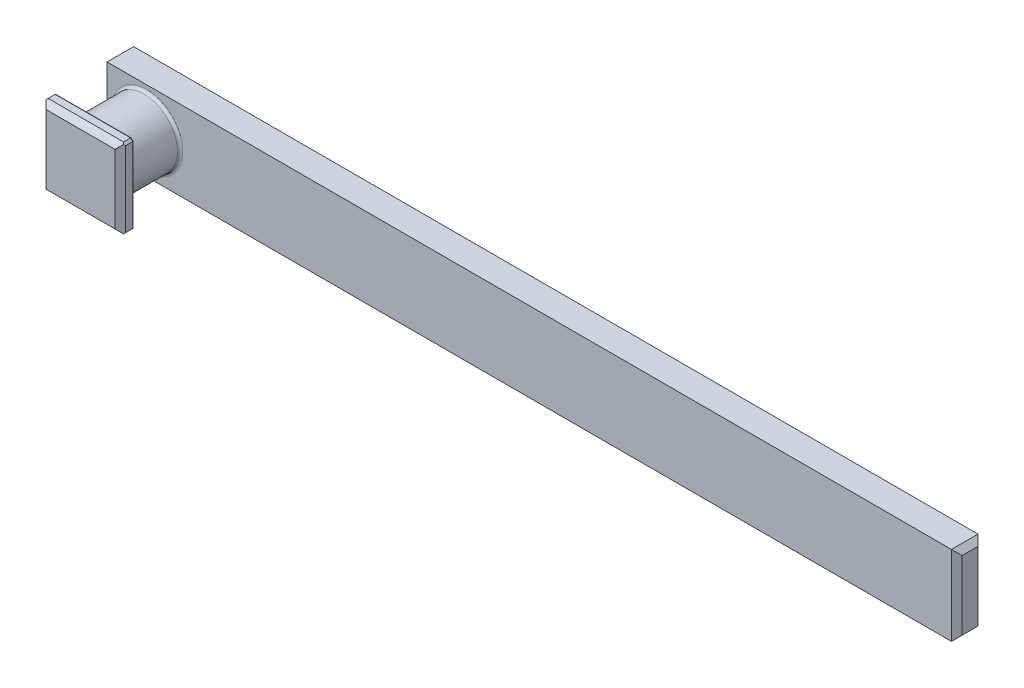
ISO-10303-21;
HEADER;
FILE_DESCRIPTION(('STEP AP214'),'2;1');
FILE_NAME('part.step','',(''),(''),'','','');
FILE_SCHEMA(('AUTOMOTIVE_DESIGN { 1 0 10303 214 1 1 1 1 }'));
ENDSEC;
DATA;
#1=APPLICATION_CONTEXT('core data for automotive mechanical design processes');
#2=APPLICATION_PROTOCOL_DEFINITION('international standard','automotive_design',2000,#1);
#3=PRODUCT_CONTEXT('',#1,'mechanical');
#4=PRODUCT('Part','Part','',(#3));
#5=PRODUCT_RELATED_PRODUCT_CATEGORY('part','',(#4));
#6=PRODUCT_DEFINITION_FORMATION('','',#4);
#7=PRODUCT_DEFINITION_CONTEXT('part definition',#1,'design');
#8=PRODUCT_DEFINITION('design','',#6,#7);
#9=PRODUCT_DEFINITION_SHAPE('','',#8);
#10=(LENGTH_UNIT() NAMED_UNIT(*) SI_UNIT(.MILLI.,.METRE.));
#11=(NAMED_UNIT(*) PLANE_ANGLE_UNIT() SI_UNIT($,.RADIAN.));
#12=(NAMED_UNIT(*) SI_UNIT($,.STERADIAN.) SOLID_ANGLE_UNIT());
#13=UNCERTAINTY_MEASURE_WITH_UNIT(LENGTH_MEASURE(1.E-05),#10,'distance_accuracy_value','');
#14=(GEOMETRIC_REPRESENTATION_CONTEXT(3) GLOBAL_UNCERTAINTY_ASSIGNED_CONTEXT((#13)) GLOBAL_UNIT_ASSIGNED_CONTEXT((#10,
#11,#12)) REPRESENTATION_CONTEXT('',''));
#15=CARTESIAN_POINT('',(0.,0.,0.));
#16=DIRECTION('',(0.,0.,1.));
#17=DIRECTION('',(1.,0.,0.));
#18=AXIS2_PLACEMENT_3D('',#15,#16,#17);
#19=CARTESIAN_POINT('',(-152.4,9.525,3.17499999999999));
#20=DIRECTION('',(1.,0.,0.));
#21=DIRECTION('',(0.,0.,-1.));
#22=AXIS2_PLACEMENT_3D('',#19,#20,#21);
#23=PLANE('',#22);
#24=DIRECTION('',(0.,0.,-1.));
#25=VECTOR('',#24,1.);
#26=CARTESIAN_POINT('',(-152.4,9.525,3.17499999999999));
#27=LINE('',#26,#25);
#28=CARTESIAN_POINT('',(-152.4,9.525,3.17499999999999));
#29=VERTEX_POINT('',#28);
#30=CARTESIAN_POINT('',(-152.4,9.525,-3.17500000000001));
#31=VERTEX_POINT('',#30);
#32=EDGE_CURVE('E200',#29,#31,#27,.T.);
#33=ORIENTED_EDGE('',*,*,#32,.T.);
#34=DIRECTION('',(0.,-1.,0.));
#35=VECTOR('',#34,1.);
#36=CARTESIAN_POINT('',(-152.4,9.525,-3.17500000000001));
#37=LINE('',#36,#35);
#38=CARTESIAN_POINT('',(-152.4,-9.525,-3.17500000000001));
#39=VERTEX_POINT('',#38);
#40=EDGE_CURVE('E206',#31,#39,#37,.T.);
#41=ORIENTED_EDGE('',*,*,#40,.T.);
#42=DIRECTION('',(0.,0.,-1.));
#43=VECTOR('',#42,1.);
#44=CARTESIAN_POINT('',(-152.4,-9.525,3.17499999999999));
#45=LINE('',#44,#43);
#46=CARTESIAN_POINT('',(-152.4,-9.525,3.17499999999999));
#47=VERTEX_POINT('',#46);
#48=EDGE_CURVE('E187',#47,#39,#45,.T.);
#49=ORIENTED_EDGE('',*,*,#48,.F.);
#50=DIRECTION('',(0.,-1.,0.));
#51=VECTOR('',#50,1.);
#52=CARTESIAN_POINT('',(-152.4,9.525,3.17499999999999));
#53=LINE('',#52,#51);
#54=EDGE_CURVE('E223',#29,#47,#53,.T.);
#55=ORIENTED_EDGE('',*,*,#54,.F.);
#56=EDGE_LOOP('',(#33,#41,#49,#55));
#57=FACE_BOUND('',#56,.T.);
#58=ADVANCED_FACE('F35',(#57),#23,.F.);
#59=CARTESIAN_POINT('',(-152.4,-9.525,3.17499999999999));
#60=DIRECTION('',(0.,1.,0.));
#61=DIRECTION('',(0.,0.,1.));
#62=AXIS2_PLACEMENT_3D('',#59,#60,#61);
#63=PLANE('',#62);
#64=DIRECTION('',(1.,0.,0.));
#65=VECTOR('',#64,1.);
#66=CARTESIAN_POINT('',(-152.4,-9.525,-3.17500000000001));
#67=LINE('',#66,#65);
#68=CARTESIAN_POINT('',(49.53,-9.525,-3.17500000000001));
#69=VERTEX_POINT('',#68);
#70=EDGE_CURVE('E191',#39,#69,#67,.T.);
#71=ORIENTED_EDGE('',*,*,#70,.T.);
#72=DIRECTION('',(0.,0.,1.));
#73=VECTOR('',#72,1.);
#74=CARTESIAN_POINT('',(49.53,-9.525,3.17499999999999));
#75=LINE('',#74,#73);
#76=CARTESIAN_POINT('',(49.53,-9.525,3.17499999999999));
#77=VERTEX_POINT('',#76);
#78=EDGE_CURVE('E237',#69,#77,#75,.T.);
#79=ORIENTED_EDGE('',*,*,#78,.T.);
#80=DIRECTION('',(1.,0.,0.));
#81=VECTOR('',#80,1.);
#82=CARTESIAN_POINT('',(-152.4,-9.525,3.17499999999999));
#83=LINE('',#82,#81);
#84=EDGE_CURVE('E194',#47,#77,#83,.T.);
#85=ORIENTED_EDGE('',*,*,#84,.F.);
#86=ORIENTED_EDGE('',*,*,#48,.T.);
#87=EDGE_LOOP('',(#71,#79,#85,#86));
#88=FACE_BOUND('',#87,.T.);
#89=ADVANCED_FACE('F189',(#88),#63,.F.);
#90=CARTESIAN_POINT('',(50.8,9.525,3.17499999999999));
#91=DIRECTION('',(-1.,0.,0.));
#92=DIRECTION('',(0.,0.,1.));
#93=AXIS2_PLACEMENT_3D('',#90,#91,#92);
#94=PLANE('',#93);
#95=DIRECTION('',(0.,-1.,0.));
#96=VECTOR('',#95,1.);
#97=CARTESIAN_POINT('',(50.8,-9.525,1.90499999999999));
#98=LINE('',#97,#96);
#99=CARTESIAN_POINT('',(50.8,8.25500000000001,1.90499999999999));
#100=VERTEX_POINT('',#99);
#101=CARTESIAN_POINT('',(50.8,-8.25500000000001,1.90499999999999));
#102=VERTEX_POINT('',#101);
#103=EDGE_CURVE('E199',#100,#102,#98,.T.);
#104=ORIENTED_EDGE('',*,*,#103,.T.);
#105=DIRECTION('',(0.,0.,-1.));
#106=VECTOR('',#105,1.);
#107=CARTESIAN_POINT('',(50.8,-8.25500000000001,3.17499999999999));
#108=LINE('',#107,#106);
#109=CARTESIAN_POINT('',(50.8,-8.25500000000001,-1.90500000000002));
#110=VERTEX_POINT('',#109);
#111=EDGE_CURVE('E234',#102,#110,#108,.T.);
#112=ORIENTED_EDGE('',*,*,#111,.T.);
#113=DIRECTION('',(0.,1.,0.));
#114=VECTOR('',#113,1.);
#115=CARTESIAN_POINT('',(50.8,9.525,-1.90500000000002));
#116=LINE('',#115,#114);
#117=CARTESIAN_POINT('',(50.8,8.25500000000001,-1.90500000000002));
#118=VERTEX_POINT('',#117);
#119=EDGE_CURVE('E232',#110,#118,#116,.T.);
#120=ORIENTED_EDGE('',*,*,#119,.T.);
#121=DIRECTION('',(0.,0.,1.));
#122=VECTOR('',#121,1.);
#123=CARTESIAN_POINT('',(50.8,8.25500000000001,3.17499999999999));
#124=LINE('',#123,#122);
#125=EDGE_CURVE('E230',#118,#100,#124,.T.);
#126=ORIENTED_EDGE('',*,*,#125,.T.);
#127=EDGE_LOOP('',(#104,#112,#120,#126));
#128=FACE_BOUND('',#127,.T.);
#129=ADVANCED_FACE('F467',(#128),#94,.F.);
#130=CARTESIAN_POINT('',(-152.4,9.525,3.17499999999999));
#131=DIRECTION('',(0.,-1.,0.));
#132=DIRECTION('',(0.,0.,-1.));
#133=AXIS2_PLACEMENT_3D('',#130,#131,#132);
#134=PLANE('',#133);
#135=DIRECTION('',(-1.,0.,0.));
#136=VECTOR('',#135,1.);
#137=CARTESIAN_POINT('',(-152.4,9.525,3.17499999999999));
#138=LINE('',#137,#136);
#139=CARTESIAN_POINT('',(49.53,9.525,3.17499999999999));
#140=VERTEX_POINT('',#139);
#141=EDGE_CURVE('E226',#140,#29,#138,.T.);
#142=ORIENTED_EDGE('',*,*,#141,.F.);
#143=DIRECTION('',(0.,0.,-1.));
#144=VECTOR('',#143,1.);
#145=CARTESIAN_POINT('',(49.53,9.525,3.17499999999999));
#146=LINE('',#145,#144);
#147=CARTESIAN_POINT('',(49.53,9.525,-3.17500000000001));
#148=VERTEX_POINT('',#147);
#149=EDGE_CURVE('E240',#140,#148,#146,.T.);
#150=ORIENTED_EDGE('',*,*,#149,.T.);
#151=DIRECTION('',(-1.,0.,0.));
#152=VECTOR('',#151,1.);
#153=CARTESIAN_POINT('',(-152.4,9.525,-3.17500000000001));
#154=LINE('',#153,#152);
#155=EDGE_CURVE('E209',#148,#31,#154,.T.);
#156=ORIENTED_EDGE('',*,*,#155,.T.);
#157=ORIENTED_EDGE('',*,*,#32,.F.);
#158=EDGE_LOOP('',(#142,#150,#156,#157));
#159=FACE_BOUND('',#158,.T.);
#160=ADVANCED_FACE('F525',(#159),#134,.F.);
#161=CARTESIAN_POINT('',(0.,0.,3.17499999999999));
#162=DIRECTION('',(0.,0.,1.));
#163=DIRECTION('',(1.,0.,0.));
#164=AXIS2_PLACEMENT_3D('',#161,#162,#163);
#165=PLANE('',#164);
#166=CARTESIAN_POINT('',(-142.875,0.,3.17499999999999));
#167=DIRECTION('',(0.,0.,1.));
#168=DIRECTION('',(1.,0.,0.));
#169=AXIS2_PLACEMENT_3D('',#166,#167,#168);
#170=CIRCLE('',#169,8.57249999999998);
#171=CARTESIAN_POINT('',(-134.3025,0.,3.17499999999999));
#172=VERTEX_POINT('',#171);
#173=EDGE_CURVE('E305',#172,#172,#170,.F.);
#174=ORIENTED_EDGE('',*,*,#173,.T.);
#175=EDGE_LOOP('',(#174));
#176=FACE_BOUND('',#175,.T.);
#177=ORIENTED_EDGE('',*,*,#84,.T.);
#178=DIRECTION('',(0.,1.,0.));
#179=VECTOR('',#178,1.);
#180=CARTESIAN_POINT('',(49.53,9.525,3.17499999999999));
#181=LINE('',#180,#179);
#182=EDGE_CURVE('E242',#77,#140,#181,.T.);
#183=ORIENTED_EDGE('',*,*,#182,.T.);
#184=ORIENTED_EDGE('',*,*,#141,.T.);
#185=ORIENTED_EDGE('',*,*,#54,.T.);
#186=EDGE_LOOP('',(#177,#183,#184,#185));
#187=FACE_BOUND('',#186,.T.);
#188=ADVANCED_FACE('F522',(#176,#187),#165,.T.);
#189=CARTESIAN_POINT('',(0.,0.,-3.17500000000001));
#190=DIRECTION('',(0.,0.,1.));
#191=DIRECTION('',(1.,0.,0.));
#192=AXIS2_PLACEMENT_3D('',#189,#190,#191);
#193=PLANE('',#192);
#194=ORIENTED_EDGE('',*,*,#155,.F.);
#195=DIRECTION('',(0.,-1.,0.));
#196=VECTOR('',#195,1.);
#197=CARTESIAN_POINT('',(49.53,0.,-3.17500000000001));
#198=LINE('',#197,#196);
#199=EDGE_CURVE('E208',#148,#69,#198,.T.);
#200=ORIENTED_EDGE('',*,*,#199,.T.);
#201=ORIENTED_EDGE('',*,*,#70,.F.);
#202=ORIENTED_EDGE('',*,*,#40,.F.);
#203=EDGE_LOOP('',(#194,#200,#201,#202));
#204=FACE_BOUND('',#203,.T.);
#205=ADVANCED_FACE('F205',(#204),#193,.F.);
#206=CARTESIAN_POINT('',(49.53,9.525,3.17499999999999));
#207=DIRECTION('',(-0.707106781186555,-0.70710678118654,0.));
#208=DIRECTION('',(0.,0.,-1.));
#209=AXIS2_PLACEMENT_3D('',#206,#207,#208);
#210=PLANE('',#209);
#211=DIRECTION('',(-0.577350269189617,0.57735026918963,-0.57735026918963));
#212=VECTOR('',#211,1.);
#213=CARTESIAN_POINT('',(51.6466666666667,7.4083333333333,-1.05833333333331));
#214=LINE('',#213,#212);
#215=EDGE_CURVE('E216',#148,#118,#214,.F.);
#216=ORIENTED_EDGE('',*,*,#215,.F.);
#217=ORIENTED_EDGE('',*,*,#149,.F.);
#218=DIRECTION('',(0.577350269189617,-0.57735026918963,-0.57735026918963));
#219=VECTOR('',#218,1.);
#220=CARTESIAN_POINT('',(52.705,6.34999999999995,0.));
#221=LINE('',#220,#219);
#222=EDGE_CURVE('E213',#100,#140,#221,.F.);
#223=ORIENTED_EDGE('',*,*,#222,.F.);
#224=ORIENTED_EDGE('',*,*,#125,.F.);
#225=EDGE_LOOP('',(#216,#217,#223,#224));
#226=FACE_BOUND('',#225,.T.);
#227=ADVANCED_FACE('F483',(#226),#210,.F.);
#228=CARTESIAN_POINT('',(49.53,0.,3.17499999999999));
#229=DIRECTION('',(0.707106781186555,0.,0.70710678118654));
#230=DIRECTION('',(0.,-1.,0.));
#231=AXIS2_PLACEMENT_3D('',#228,#229,#230);
#232=PLANE('',#231);
#233=ORIENTED_EDGE('',*,*,#222,.T.);
#234=ORIENTED_EDGE('',*,*,#182,.F.);
#235=DIRECTION('',(-0.577350269189617,-0.57735026918963,0.57735026918963));
#236=VECTOR('',#235,1.);
#237=CARTESIAN_POINT('',(52.705,-6.34999999999995,0.));
#238=LINE('',#237,#236);
#239=EDGE_CURVE('E247',#102,#77,#238,.T.);
#240=ORIENTED_EDGE('',*,*,#239,.F.);
#241=ORIENTED_EDGE('',*,*,#103,.F.);
#242=EDGE_LOOP('',(#233,#234,#240,#241));
#243=FACE_BOUND('',#242,.T.);
#244=ADVANCED_FACE('F479',(#243),#232,.T.);
#245=CARTESIAN_POINT('',(50.8,9.525,-1.90500000000002));
#246=DIRECTION('',(-0.707106781186555,0.,0.70710678118654));
#247=DIRECTION('',(0.,1.,0.));
#248=AXIS2_PLACEMENT_3D('',#245,#246,#247);
#249=PLANE('',#248);
#250=ORIENTED_EDGE('',*,*,#215,.T.);
#251=ORIENTED_EDGE('',*,*,#119,.F.);
#252=DIRECTION('',(-0.577350269189617,-0.57735026918963,-0.57735026918963));
#253=VECTOR('',#252,1.);
#254=CARTESIAN_POINT('',(56.7266666666666,-2.32833333333325,4.02166666666674));
#255=LINE('',#254,#253);
#256=EDGE_CURVE('E245',#69,#110,#255,.F.);
#257=ORIENTED_EDGE('',*,*,#256,.F.);
#258=ORIENTED_EDGE('',*,*,#199,.F.);
#259=EDGE_LOOP('',(#250,#251,#257,#258));
#260=FACE_BOUND('',#259,.T.);
#261=ADVANCED_FACE('F475',(#260),#249,.F.);
#262=CARTESIAN_POINT('',(50.8,-8.25500000000001,3.17499999999999));
#263=DIRECTION('',(-0.707106781186555,0.70710678118654,0.));
#264=DIRECTION('',(0.,0.,-1.));
#265=AXIS2_PLACEMENT_3D('',#262,#263,#264);
#266=PLANE('',#265);
#267=ORIENTED_EDGE('',*,*,#239,.T.);
#268=ORIENTED_EDGE('',*,*,#78,.F.);
#269=ORIENTED_EDGE('',*,*,#256,.T.);
#270=ORIENTED_EDGE('',*,*,#111,.F.);
#271=EDGE_LOOP('',(#267,#268,#269,#270));
#272=FACE_BOUND('',#271,.T.);
#273=ADVANCED_FACE('F471',(#272),#266,.F.);
#274=CARTESIAN_POINT('',(-142.875,0.,15.875));
#275=DIRECTION('',(0.,0.,-1.));
#276=DIRECTION('',(-1.,0.,0.));
#277=AXIS2_PLACEMENT_3D('',#274,#275,#276);
#278=CYLINDRICAL_SURFACE('',#277,7.93749999999998);
#279=CARTESIAN_POINT('',(-142.875,0.,15.24));
#280=DIRECTION('',(0.,0.,-1.));
#281=DIRECTION('',(-1.,0.,0.));
#282=AXIS2_PLACEMENT_3D('',#279,#280,#281);
#283=CIRCLE('',#282,7.93749999999998);
#284=CARTESIAN_POINT('',(-150.8125,0.,15.24));
#285=VERTEX_POINT('',#284);
#286=EDGE_CURVE('E302',#285,#285,#283,.T.);
#287=ORIENTED_EDGE('',*,*,#286,.T.);
#288=EDGE_LOOP('',(#287));
#289=FACE_BOUND('',#288,.T.);
#290=CARTESIAN_POINT('',(-142.875,0.,3.80999999999999));
#291=DIRECTION('',(0.,0.,1.));
#292=DIRECTION('',(1.,0.,0.));
#293=AXIS2_PLACEMENT_3D('',#290,#291,#292);
#294=CIRCLE('',#293,7.93749999999998);
#295=CARTESIAN_POINT('',(-134.9375,0.,3.80999999999999));
#296=VERTEX_POINT('',#295);
#297=EDGE_CURVE('E299',#296,#296,#294,.T.);
#298=ORIENTED_EDGE('',*,*,#297,.T.);
#299=EDGE_LOOP('',(#298));
#300=FACE_BOUND('',#299,.T.);
#301=ADVANCED_FACE('F474',(#289,#300),#278,.T.);
#302=CARTESIAN_POINT('',(-152.4,9.017,19.05));
#303=DIRECTION('',(0.707106781186522,-0.707106781186573,0.));
#304=DIRECTION('',(0.707106781186573,0.707106781186522,0.));
#305=AXIS2_PLACEMENT_3D('',#302,#303,#304);
#306=PLANE('',#305);
#307=DIRECTION('',(0.,0.,-1.));
#308=VECTOR('',#307,1.);
#309=CARTESIAN_POINT('',(-151.892,9.525,19.05));
#310=LINE('',#309,#308);
#311=CARTESIAN_POINT('',(-151.892,9.525,17.78));
#312=VERTEX_POINT('',#311);
#313=CARTESIAN_POINT('',(-151.892,9.525,16.129));
#314=VERTEX_POINT('',#313);
#315=EDGE_CURVE('E296',#312,#314,#310,.T.);
#316=ORIENTED_EDGE('',*,*,#315,.T.);
#317=DIRECTION('',(-0.707106781186573,-0.707106781186522,0.));
#318=VECTOR('',#317,1.);
#319=CARTESIAN_POINT('',(-152.4,9.017,16.129));
#320=LINE('',#319,#318);
#321=CARTESIAN_POINT('',(-152.4,9.017,16.129));
#322=VERTEX_POINT('',#321);
#323=EDGE_CURVE('E11',#314,#322,#320,.T.);
#324=ORIENTED_EDGE('',*,*,#323,.T.);
#325=DIRECTION('',(0.,0.,-1.));
#326=VECTOR('',#325,1.);
#327=CARTESIAN_POINT('',(-152.4,9.017,19.05));
#328=LINE('',#327,#326);
#329=CARTESIAN_POINT('',(-152.4,9.017,17.78));
#330=VERTEX_POINT('',#329);
#331=EDGE_CURVE('E219',#330,#322,#328,.T.);
#332=ORIENTED_EDGE('',*,*,#331,.F.);
#333=DIRECTION('',(-0.577350269189635,-0.577350269189594,-0.577350269189648));
#334=VECTOR('',#333,1.);
#335=CARTESIAN_POINT('',(-154.559,6.85800000000031,15.6210000000001));
#336=LINE('',#335,#334);
#337=CARTESIAN_POINT('',(-152.146,9.27099999999999,18.034));
#338=VERTEX_POINT('',#337);
#339=EDGE_CURVE('E259',#330,#338,#336,.F.);
#340=ORIENTED_EDGE('',*,*,#339,.T.);
#341=DIRECTION('',(-0.577350269189651,-0.57735026918961,0.577350269189617));
#342=VECTOR('',#341,1.);
#343=CARTESIAN_POINT('',(-102.107999999996,59.3090000000008,-32.0040000000015));
#344=LINE('',#343,#342);
#345=EDGE_CURVE('E261',#338,#312,#344,.F.);
#346=ORIENTED_EDGE('',*,*,#345,.T.);
#347=EDGE_LOOP('',(#316,#324,#332,#340,#346));
#348=FACE_BOUND('',#347,.T.);
#349=ADVANCED_FACE('F385',(#348),#306,.F.);
#350=CARTESIAN_POINT('',(-152.4,-9.01700000000005,19.05));
#351=DIRECTION('',(1.,0.,0.));
#352=DIRECTION('',(0.,0.,-1.));
#353=AXIS2_PLACEMENT_3D('',#350,#351,#352);
#354=PLANE('',#353);
#355=ORIENTED_EDGE('',*,*,#331,.T.);
#356=DIRECTION('',(0.,-1.,0.));
#357=VECTOR('',#356,1.);
#358=CARTESIAN_POINT('',(-152.4,-9.01700000000005,16.129));
#359=LINE('',#358,#357);
#360=CARTESIAN_POINT('',(-152.4,-9.01700000000005,16.129));
#361=VERTEX_POINT('',#360);
#362=EDGE_CURVE('E308',#322,#361,#359,.T.);
#363=ORIENTED_EDGE('',*,*,#362,.T.);
#364=DIRECTION('',(0.,0.,-1.));
#365=VECTOR('',#364,1.);
#366=CARTESIAN_POINT('',(-152.4,-9.01700000000005,19.05));
#367=LINE('',#366,#365);
#368=CARTESIAN_POINT('',(-152.4,-9.01700000000005,17.78));
#369=VERTEX_POINT('',#368);
#370=EDGE_CURVE('E392',#369,#361,#367,.T.);
#371=ORIENTED_EDGE('',*,*,#370,.F.);
#372=DIRECTION('',(0.,1.,0.));
#373=VECTOR('',#372,1.);
#374=CARTESIAN_POINT('',(-152.4,-9.01700000000005,17.78));
#375=LINE('',#374,#373);
#376=EDGE_CURVE('E282',#369,#330,#375,.T.);
#377=ORIENTED_EDGE('',*,*,#376,.T.);
#378=EDGE_LOOP('',(#355,#363,#371,#377));
#379=FACE_BOUND('',#378,.T.);
#380=ADVANCED_FACE('F388',(#379),#354,.F.);
#381=CARTESIAN_POINT('',(-152.4,-9.01700000000005,19.05));
#382=DIRECTION('',(0.707106781186522,0.707106781186573,0.));
#383=DIRECTION('',(-0.707106781186573,0.707106781186522,0.));
#384=AXIS2_PLACEMENT_3D('',#381,#382,#383);
#385=PLANE('',#384);
#386=ORIENTED_EDGE('',*,*,#370,.T.);
#387=DIRECTION('',(0.707106781186573,-0.707106781186522,0.));
#388=VECTOR('',#387,1.);
#389=CARTESIAN_POINT('',(-151.892,-9.52500000000005,16.129));
#390=LINE('',#389,#388);
#391=CARTESIAN_POINT('',(-151.892,-9.52500000000005,16.129));
#392=VERTEX_POINT('',#391);
#393=EDGE_CURVE('E328',#361,#392,#390,.T.);
#394=ORIENTED_EDGE('',*,*,#393,.T.);
#395=DIRECTION('',(0.,0.,-1.));
#396=VECTOR('',#395,1.);
#397=CARTESIAN_POINT('',(-151.892,-9.52500000000005,19.05));
#398=LINE('',#397,#396);
#399=CARTESIAN_POINT('',(-151.892,-9.52500000000005,17.78));
#400=VERTEX_POINT('',#399);
#401=EDGE_CURVE('E393',#400,#392,#398,.T.);
#402=ORIENTED_EDGE('',*,*,#401,.F.);
#403=DIRECTION('',(0.577350269189651,-0.57735026918961,-0.577350269189617));
#404=VECTOR('',#403,1.);
#405=CARTESIAN_POINT('',(-102.107999999996,-59.3090000000009,-32.0040000000015));
#406=LINE('',#405,#404);
#407=CARTESIAN_POINT('',(-152.146,-9.27100000000004,18.034));
#408=VERTEX_POINT('',#407);
#409=EDGE_CURVE('E280',#400,#408,#406,.F.);
#410=ORIENTED_EDGE('',*,*,#409,.T.);
#411=DIRECTION('',(0.577350269189635,-0.577350269189594,0.577350269189648));
#412=VECTOR('',#411,1.);
#413=CARTESIAN_POINT('',(-154.559,-6.85800000000035,15.6210000000001));
#414=LINE('',#413,#412);
#415=EDGE_CURVE('E278',#408,#369,#414,.F.);
#416=ORIENTED_EDGE('',*,*,#415,.T.);
#417=EDGE_LOOP('',(#386,#394,#402,#410,#416));
#418=FACE_BOUND('',#417,.T.);
#419=ADVANCED_FACE('F604',(#418),#385,.F.);
#420=CARTESIAN_POINT('',(-151.892,-9.52500000000005,19.05));
#421=DIRECTION('',(0.,1.,0.));
#422=DIRECTION('',(0.,0.,1.));
#423=AXIS2_PLACEMENT_3D('',#420,#421,#422);
#424=PLANE('',#423);
#425=ORIENTED_EDGE('',*,*,#401,.T.);
#426=DIRECTION('',(1.,0.,0.));
#427=VECTOR('',#426,1.);
#428=CARTESIAN_POINT('',(-133.858,-9.52500000000005,16.129));
#429=LINE('',#428,#427);
#430=CARTESIAN_POINT('',(-133.858,-9.52500000000005,16.129));
#431=VERTEX_POINT('',#430);
#432=EDGE_CURVE('E330',#392,#431,#429,.T.);
#433=ORIENTED_EDGE('',*,*,#432,.T.);
#434=DIRECTION('',(0.,0.,-1.));
#435=VECTOR('',#434,1.);
#436=CARTESIAN_POINT('',(-133.858,-9.52500000000005,19.05));
#437=LINE('',#436,#435);
#438=CARTESIAN_POINT('',(-133.858,-9.52500000000005,17.78));
#439=VERTEX_POINT('',#438);
#440=EDGE_CURVE('E396',#439,#431,#437,.T.);
#441=ORIENTED_EDGE('',*,*,#440,.F.);
#442=DIRECTION('',(-1.,0.,0.));
#443=VECTOR('',#442,1.);
#444=CARTESIAN_POINT('',(-151.892,-9.52500000000005,17.78));
#445=LINE('',#444,#443);
#446=EDGE_CURVE('E276',#439,#400,#445,.T.);
#447=ORIENTED_EDGE('',*,*,#446,.T.);
#448=EDGE_LOOP('',(#425,#433,#441,#447));
#449=FACE_BOUND('',#448,.T.);
#450=ADVANCED_FACE('F440',(#449),#424,.F.);
#451=CARTESIAN_POINT('',(-133.858,-9.52500000000005,19.05));
#452=DIRECTION('',(-0.707106781186522,0.707106781186573,0.));
#453=DIRECTION('',(-0.707106781186573,-0.707106781186522,0.));
#454=AXIS2_PLACEMENT_3D('',#451,#452,#453);
#455=PLANE('',#454);
#456=ORIENTED_EDGE('',*,*,#440,.T.);
#457=DIRECTION('',(0.707106781186573,0.707106781186522,0.));
#458=VECTOR('',#457,1.);
#459=CARTESIAN_POINT('',(-133.35,-9.01700000000005,16.129));
#460=LINE('',#459,#458);
#461=CARTESIAN_POINT('',(-133.35,-9.01700000000005,16.129));
#462=VERTEX_POINT('',#461);
#463=EDGE_CURVE('E332',#431,#462,#460,.T.);
#464=ORIENTED_EDGE('',*,*,#463,.T.);
#465=DIRECTION('',(0.,0.,-1.));
#466=VECTOR('',#465,1.);
#467=CARTESIAN_POINT('',(-133.35,-9.01700000000005,19.05));
#468=LINE('',#467,#466);
#469=CARTESIAN_POINT('',(-133.35,-9.01700000000005,17.78));
#470=VERTEX_POINT('',#469);
#471=EDGE_CURVE('E401',#470,#462,#468,.T.);
#472=ORIENTED_EDGE('',*,*,#471,.F.);
#473=DIRECTION('',(0.577350269189635,0.577350269189594,-0.577350269189648));
#474=VECTOR('',#473,1.);
#475=CARTESIAN_POINT('',(-131.191,-6.85800000000035,15.6210000000001));
#476=LINE('',#475,#474);
#477=CARTESIAN_POINT('',(-133.604,-9.27100000000002,18.034));
#478=VERTEX_POINT('',#477);
#479=EDGE_CURVE('E274',#470,#478,#476,.F.);
#480=ORIENTED_EDGE('',*,*,#479,.T.);
#481=DIRECTION('',(0.577350269189651,0.57735026918961,0.577350269189617));
#482=VECTOR('',#481,1.);
#483=CARTESIAN_POINT('',(-88.3919999999961,35.9410000000006,63.2460000000012));
#484=LINE('',#483,#482);
#485=EDGE_CURVE('E272',#478,#439,#484,.F.);
#486=ORIENTED_EDGE('',*,*,#485,.T.);
#487=EDGE_LOOP('',(#456,#464,#472,#480,#486));
#488=FACE_BOUND('',#487,.T.);
#489=ADVANCED_FACE('F437',(#488),#455,.F.);
#490=CARTESIAN_POINT('',(-133.35,-9.01700000000005,19.05));
#491=DIRECTION('',(-1.,0.,0.));
#492=DIRECTION('',(0.,0.,1.));
#493=AXIS2_PLACEMENT_3D('',#490,#491,#492);
#494=PLANE('',#493);
#495=ORIENTED_EDGE('',*,*,#471,.T.);
#496=DIRECTION('',(0.,1.,0.));
#497=VECTOR('',#496,1.);
#498=CARTESIAN_POINT('',(-133.35,9.017,16.129));
#499=LINE('',#498,#497);
#500=CARTESIAN_POINT('',(-133.35,9.017,16.129));
#501=VERTEX_POINT('',#500);
#502=EDGE_CURVE('E334',#462,#501,#499,.T.);
#503=ORIENTED_EDGE('',*,*,#502,.T.);
#504=DIRECTION('',(0.,0.,-1.));
#505=VECTOR('',#504,1.);
#506=CARTESIAN_POINT('',(-133.35,9.017,19.05));
#507=LINE('',#506,#505);
#508=CARTESIAN_POINT('',(-133.35,9.017,17.78));
#509=VERTEX_POINT('',#508);
#510=EDGE_CURVE('E404',#509,#501,#507,.T.);
#511=ORIENTED_EDGE('',*,*,#510,.F.);
#512=DIRECTION('',(0.,-1.,0.));
#513=VECTOR('',#512,1.);
#514=CARTESIAN_POINT('',(-133.35,-9.01700000000005,17.78));
#515=LINE('',#514,#513);
#516=EDGE_CURVE('E270',#509,#470,#515,.T.);
#517=ORIENTED_EDGE('',*,*,#516,.T.);
#518=EDGE_LOOP('',(#495,#503,#511,#517));
#519=FACE_BOUND('',#518,.T.);
#520=ADVANCED_FACE('F628',(#519),#494,.F.);
#521=CARTESIAN_POINT('',(-133.858,9.525,19.05));
#522=DIRECTION('',(-0.707106781186522,-0.707106781186573,0.));
#523=DIRECTION('',(0.707106781186573,-0.707106781186522,0.));
#524=AXIS2_PLACEMENT_3D('',#521,#522,#523);
#525=PLANE('',#524);
#526=ORIENTED_EDGE('',*,*,#510,.T.);
#527=DIRECTION('',(-0.707106781186573,0.707106781186522,0.));
#528=VECTOR('',#527,1.);
#529=CARTESIAN_POINT('',(-133.858,9.525,16.129));
#530=LINE('',#529,#528);
#531=CARTESIAN_POINT('',(-133.858,9.525,16.129));
#532=VERTEX_POINT('',#531);
#533=EDGE_CURVE('E59',#501,#532,#530,.T.);
#534=ORIENTED_EDGE('',*,*,#533,.T.);
#535=DIRECTION('',(0.,0.,-1.));
#536=VECTOR('',#535,1.);
#537=CARTESIAN_POINT('',(-133.858,9.525,19.05));
#538=LINE('',#537,#536);
#539=CARTESIAN_POINT('',(-133.858,9.525,17.78));
#540=VERTEX_POINT('',#539);
#541=EDGE_CURVE('E406',#540,#532,#538,.T.);
#542=ORIENTED_EDGE('',*,*,#541,.F.);
#543=DIRECTION('',(-0.577350269189651,0.57735026918961,-0.577350269189617));
#544=VECTOR('',#543,1.);
#545=CARTESIAN_POINT('',(-88.3919999999961,-35.9410000000007,63.2460000000012));
#546=LINE('',#545,#544);
#547=CARTESIAN_POINT('',(-133.604,9.27099999999999,18.034));
#548=VERTEX_POINT('',#547);
#549=EDGE_CURVE('E268',#540,#548,#546,.F.);
#550=ORIENTED_EDGE('',*,*,#549,.T.);
#551=DIRECTION('',(-0.577350269189635,0.577350269189594,0.577350269189648));
#552=VECTOR('',#551,1.);
#553=CARTESIAN_POINT('',(-131.191,6.85800000000031,15.6210000000001));
#554=LINE('',#553,#552);
#555=EDGE_CURVE('E266',#548,#509,#554,.F.);
#556=ORIENTED_EDGE('',*,*,#555,.T.);
#557=EDGE_LOOP('',(#526,#534,#542,#550,#556));
#558=FACE_BOUND('',#557,.T.);
#559=ADVANCED_FACE('F410',(#558),#525,.F.);
#560=CARTESIAN_POINT('',(-151.892,9.525,19.05));
#561=DIRECTION('',(0.,-1.,0.));
#562=DIRECTION('',(0.,0.,-1.));
#563=AXIS2_PLACEMENT_3D('',#560,#561,#562);
#564=PLANE('',#563);
#565=ORIENTED_EDGE('',*,*,#541,.T.);
#566=DIRECTION('',(-1.,0.,0.));
#567=VECTOR('',#566,1.);
#568=CARTESIAN_POINT('',(-151.892,9.525,16.129));
#569=LINE('',#568,#567);
#570=EDGE_CURVE('E44',#532,#314,#569,.T.);
#571=ORIENTED_EDGE('',*,*,#570,.T.);
#572=ORIENTED_EDGE('',*,*,#315,.F.);
#573=DIRECTION('',(1.,0.,0.));
#574=VECTOR('',#573,1.);
#575=CARTESIAN_POINT('',(-151.892,9.525,17.78));
#576=LINE('',#575,#574);
#577=EDGE_CURVE('E263',#312,#540,#576,.T.);
#578=ORIENTED_EDGE('',*,*,#577,.T.);
#579=EDGE_LOOP('',(#565,#571,#572,#578));
#580=FACE_BOUND('',#579,.T.);
#581=ADVANCED_FACE('F408',(#580),#564,.F.);
#582=CARTESIAN_POINT('',(0.,0.,19.05));
#583=DIRECTION('',(0.,0.,-1.));
#584=DIRECTION('',(-1.,0.,0.));
#585=AXIS2_PLACEMENT_3D('',#582,#583,#584);
#586=PLANE('',#585);
#587=DIRECTION('',(0.,1.,0.));
#588=VECTOR('',#587,1.);
#589=CARTESIAN_POINT('',(-134.62,0.,19.05));
#590=LINE('',#589,#588);
#591=CARTESIAN_POINT('',(-134.62,-8.25500000000004,19.05));
#592=VERTEX_POINT('',#591);
#593=CARTESIAN_POINT('',(-134.62,8.255,19.05));
#594=VERTEX_POINT('',#593);
#595=EDGE_CURVE('E254',#592,#594,#590,.T.);
#596=ORIENTED_EDGE('',*,*,#595,.T.);
#597=DIRECTION('',(-1.,0.,0.));
#598=VECTOR('',#597,1.);
#599=CARTESIAN_POINT('',(0.,8.255,19.05));
#600=LINE('',#599,#598);
#601=CARTESIAN_POINT('',(-151.13,8.255,19.05));
#602=VERTEX_POINT('',#601);
#603=EDGE_CURVE('E256',#594,#602,#600,.T.);
#604=ORIENTED_EDGE('',*,*,#603,.T.);
#605=DIRECTION('',(0.,-1.,0.));
#606=VECTOR('',#605,1.);
#607=CARTESIAN_POINT('',(-151.13,0.,19.05));
#608=LINE('',#607,#606);
#609=CARTESIAN_POINT('',(-151.13,-8.25500000000004,19.05));
#610=VERTEX_POINT('',#609);
#611=EDGE_CURVE('E244',#602,#610,#608,.T.);
#612=ORIENTED_EDGE('',*,*,#611,.T.);
#613=DIRECTION('',(1.,0.,0.));
#614=VECTOR('',#613,1.);
#615=CARTESIAN_POINT('',(0.,-8.25500000000004,19.05));
#616=LINE('',#615,#614);
#617=EDGE_CURVE('E252',#610,#592,#616,.T.);
#618=ORIENTED_EDGE('',*,*,#617,.T.);
#619=EDGE_LOOP('',(#596,#604,#612,#618));
#620=FACE_BOUND('',#619,.T.);
#621=ADVANCED_FACE('F426',(#620),#586,.F.);
#622=CARTESIAN_POINT('',(0.,0.,15.875));
#623=DIRECTION('',(0.,0.,-1.));
#624=DIRECTION('',(-1.,0.,0.));
#625=AXIS2_PLACEMENT_3D('',#622,#623,#624);
#626=PLANE('',#625);
#627=DIRECTION('',(0.707106781186573,-0.707106781186522,0.));
#628=VECTOR('',#627,1.);
#629=CARTESIAN_POINT('',(-152.220394877579,-8.83739487757866,15.875));
#630=LINE('',#629,#628);
#631=CARTESIAN_POINT('',(-151.786789755157,-9.27100000000005,15.875));
#632=VERTEX_POINT('',#631);
#633=CARTESIAN_POINT('',(-152.146,-8.91178975515728,15.875));
#634=VERTEX_POINT('',#633);
#635=EDGE_CURVE('E323',#632,#634,#630,.F.);
#636=ORIENTED_EDGE('',*,*,#635,.T.);
#637=DIRECTION('',(0.,-1.,0.));
#638=VECTOR('',#637,1.);
#639=CARTESIAN_POINT('',(-152.146,9.017,15.875));
#640=LINE('',#639,#638);
#641=CARTESIAN_POINT('',(-152.146,8.91178975515723,15.875));
#642=VERTEX_POINT('',#641);
#643=EDGE_CURVE('E325',#634,#642,#640,.F.);
#644=ORIENTED_EDGE('',*,*,#643,.T.);
#645=DIRECTION('',(-0.707106781186573,-0.707106781186522,0.));
#646=VECTOR('',#645,1.);
#647=CARTESIAN_POINT('',(-151.712394877579,9.34539487757861,15.875));
#648=LINE('',#647,#646);
#649=CARTESIAN_POINT('',(-151.786789755157,9.27099999999999,15.875));
#650=VERTEX_POINT('',#649);
#651=EDGE_CURVE('E311',#642,#650,#648,.F.);
#652=ORIENTED_EDGE('',*,*,#651,.T.);
#653=DIRECTION('',(-1.,0.,0.));
#654=VECTOR('',#653,1.);
#655=CARTESIAN_POINT('',(-133.858,9.271,15.875));
#656=LINE('',#655,#654);
#657=CARTESIAN_POINT('',(-133.963210244843,9.271,15.875));
#658=VERTEX_POINT('',#657);
#659=EDGE_CURVE('E313',#650,#658,#656,.F.);
#660=ORIENTED_EDGE('',*,*,#659,.T.);
#661=DIRECTION('',(-0.707106781186573,0.707106781186522,0.));
#662=VECTOR('',#661,1.);
#663=CARTESIAN_POINT('',(-133.529605122421,8.83739487757861,15.875));
#664=LINE('',#663,#662);
#665=CARTESIAN_POINT('',(-133.604,8.91178975515723,15.875));
#666=VERTEX_POINT('',#665);
#667=EDGE_CURVE('E315',#658,#666,#664,.F.);
#668=ORIENTED_EDGE('',*,*,#667,.T.);
#669=DIRECTION('',(0.,1.,0.));
#670=VECTOR('',#669,1.);
#671=CARTESIAN_POINT('',(-133.604,-9.01700000000005,15.875));
#672=LINE('',#671,#670);
#673=CARTESIAN_POINT('',(-133.604,-8.91178975515728,15.875));
#674=VERTEX_POINT('',#673);
#675=EDGE_CURVE('E317',#666,#674,#672,.F.);
#676=ORIENTED_EDGE('',*,*,#675,.T.);
#677=DIRECTION('',(0.707106781186573,0.707106781186522,0.));
#678=VECTOR('',#677,1.);
#679=CARTESIAN_POINT('',(-134.037605122421,-9.34539487757866,15.875));
#680=LINE('',#679,#678);
#681=CARTESIAN_POINT('',(-133.963210244843,-9.27100000000004,15.875));
#682=VERTEX_POINT('',#681);
#683=EDGE_CURVE('E319',#674,#682,#680,.F.);
#684=ORIENTED_EDGE('',*,*,#683,.T.);
#685=DIRECTION('',(1.,0.,0.));
#686=VECTOR('',#685,1.);
#687=CARTESIAN_POINT('',(-151.892,-9.27100000000005,15.875));
#688=LINE('',#687,#686);
#689=EDGE_CURVE('E321',#682,#632,#688,.F.);
#690=ORIENTED_EDGE('',*,*,#689,.T.);
#691=EDGE_LOOP('',(#636,#644,#652,#660,#668,#676,#684,#690));
#692=FACE_BOUND('',#691,.T.);
#693=CARTESIAN_POINT('',(-142.875,0.,15.875));
#694=DIRECTION('',(0.,0.,-1.));
#695=DIRECTION('',(-1.,0.,0.));
#696=AXIS2_PLACEMENT_3D('',#693,#694,#695);
#697=CIRCLE('',#696,8.57249999999998);
#698=CARTESIAN_POINT('',(-151.4475,0.,15.875));
#699=VERTEX_POINT('',#698);
#700=EDGE_CURVE('E284',#699,#699,#697,.F.);
#701=ORIENTED_EDGE('',*,*,#700,.T.);
#702=EDGE_LOOP('',(#701));
#703=FACE_BOUND('',#702,.T.);
#704=ADVANCED_FACE('F369',(#692,#703),#626,.T.);
#705=CARTESIAN_POINT('',(0.,-8.25500000000004,19.05));
#706=DIRECTION('',(0.,0.707106781186552,-0.707106781186543));
#707=DIRECTION('',(1.,0.,0.));
#708=AXIS2_PLACEMENT_3D('',#705,#706,#707);
#709=PLANE('',#708);
#710=ORIENTED_EDGE('',*,*,#446,.F.);
#711=ORIENTED_EDGE('',*,*,#485,.F.);
#712=DIRECTION('',(-0.57735026918962,0.577350269189625,0.577350269189632));
#713=VECTOR('',#712,1.);
#714=CARTESIAN_POINT('',(-89.7466666666676,-53.1283333333328,-25.8233333333334));
#715=LINE('',#714,#713);
#716=EDGE_CURVE('E293',#592,#478,#715,.F.);
#717=ORIENTED_EDGE('',*,*,#716,.F.);
#718=ORIENTED_EDGE('',*,*,#617,.F.);
#719=DIRECTION('',(0.57735026918962,0.577350269189625,0.577350269189632));
#720=VECTOR('',#719,1.);
#721=CARTESIAN_POINT('',(-148.378333333333,-5.50333333333337,21.8016666666667));
#722=LINE('',#721,#720);
#723=EDGE_CURVE('E290',#408,#610,#722,.T.);
#724=ORIENTED_EDGE('',*,*,#723,.F.);
#725=ORIENTED_EDGE('',*,*,#409,.F.);
#726=EDGE_LOOP('',(#710,#711,#717,#718,#724,#725));
#727=FACE_BOUND('',#726,.T.);
#728=ADVANCED_FACE('F432',(#727),#709,.F.);
#729=CARTESIAN_POINT('',(-134.62,0.,19.05));
#730=DIRECTION('',(-0.707106781186555,0.,-0.70710678118654));
#731=DIRECTION('',(0.,1.,0.));
#732=AXIS2_PLACEMENT_3D('',#729,#730,#731);
#733=PLANE('',#732);
#734=ORIENTED_EDGE('',*,*,#516,.F.);
#735=ORIENTED_EDGE('',*,*,#555,.F.);
#736=DIRECTION('',(-0.57735026918962,-0.577350269189625,0.577350269189632));
#737=VECTOR('',#736,1.);
#738=CARTESIAN_POINT('',(-137.371666666667,5.50333333333333,21.8016666666667));
#739=LINE('',#738,#737);
#740=EDGE_CURVE('E287',#594,#548,#739,.F.);
#741=ORIENTED_EDGE('',*,*,#740,.F.);
#742=ORIENTED_EDGE('',*,*,#595,.F.);
#743=ORIENTED_EDGE('',*,*,#716,.T.);
#744=ORIENTED_EDGE('',*,*,#479,.F.);
#745=EDGE_LOOP('',(#734,#735,#741,#742,#743,#744));
#746=FACE_BOUND('',#745,.T.);
#747=ADVANCED_FACE('F417',(#746),#733,.F.);
#748=CARTESIAN_POINT('',(-151.13,0.,19.05));
#749=DIRECTION('',(0.707106781186555,0.,-0.70710678118654));
#750=DIRECTION('',(0.,-1.,0.));
#751=AXIS2_PLACEMENT_3D('',#748,#749,#750);
#752=PLANE('',#751);
#753=ORIENTED_EDGE('',*,*,#723,.T.);
#754=ORIENTED_EDGE('',*,*,#611,.F.);
#755=DIRECTION('',(-0.57735026918962,0.577350269189625,-0.577350269189632));
#756=VECTOR('',#755,1.);
#757=CARTESIAN_POINT('',(-148.378333333333,5.50333333333333,21.8016666666667));
#758=LINE('',#757,#756);
#759=EDGE_CURVE('E285',#338,#602,#758,.F.);
#760=ORIENTED_EDGE('',*,*,#759,.F.);
#761=ORIENTED_EDGE('',*,*,#339,.F.);
#762=ORIENTED_EDGE('',*,*,#376,.F.);
#763=ORIENTED_EDGE('',*,*,#415,.F.);
#764=EDGE_LOOP('',(#753,#754,#760,#761,#762,#763));
#765=FACE_BOUND('',#764,.T.);
#766=ADVANCED_FACE('F491',(#765),#752,.F.);
#767=CARTESIAN_POINT('',(0.,8.255,19.05));
#768=DIRECTION('',(0.,-0.707106781186552,-0.707106781186543));
#769=DIRECTION('',(-1.,0.,0.));
#770=AXIS2_PLACEMENT_3D('',#767,#768,#769);
#771=PLANE('',#770);
#772=ORIENTED_EDGE('',*,*,#549,.F.);
#773=ORIENTED_EDGE('',*,*,#577,.F.);
#774=ORIENTED_EDGE('',*,*,#345,.F.);
#775=ORIENTED_EDGE('',*,*,#759,.T.);
#776=ORIENTED_EDGE('',*,*,#603,.F.);
#777=ORIENTED_EDGE('',*,*,#740,.T.);
#778=EDGE_LOOP('',(#772,#773,#774,#775,#776,#777));
#779=FACE_BOUND('',#778,.T.);
#780=ADVANCED_FACE('F421',(#779),#771,.F.);
#781=CARTESIAN_POINT('',(-142.875,0.,15.24));
#782=DIRECTION('',(0.,0.,-1.));
#783=DIRECTION('',(-1.,0.,0.));
#784=AXIS2_PLACEMENT_3D('',#781,#782,#783);
#785=TOROIDAL_SURFACE('',#784,8.57249999999998,0.635);
#786=ORIENTED_EDGE('',*,*,#286,.F.);
#787=EDGE_LOOP('',(#786));
#788=FACE_BOUND('',#787,.T.);
#789=ORIENTED_EDGE('',*,*,#700,.F.);
#790=EDGE_LOOP('',(#789));
#791=FACE_BOUND('',#790,.T.);
#792=ADVANCED_FACE('F490',(#788,#791),#785,.F.);
#793=CARTESIAN_POINT('',(-142.875,0.,3.80999999999999));
#794=DIRECTION('',(0.,0.,1.));
#795=DIRECTION('',(1.,0.,0.));
#796=AXIS2_PLACEMENT_3D('',#793,#794,#795);
#797=TOROIDAL_SURFACE('',#796,8.57249999999998,0.635);
#798=ORIENTED_EDGE('',*,*,#173,.F.);
#799=EDGE_LOOP('',(#798));
#800=FACE_BOUND('',#799,.T.);
#801=ORIENTED_EDGE('',*,*,#297,.F.);
#802=EDGE_LOOP('',(#801));
#803=FACE_BOUND('',#802,.T.);
#804=ADVANCED_FACE('F500',(#800,#803),#797,.F.);
#805=CARTESIAN_POINT('',(-133.604,-9.01700000000005,16.129));
#806=DIRECTION('',(0.,-1.,0.));
#807=DIRECTION('',(0.,0.,-1.));
#808=AXIS2_PLACEMENT_3D('',#805,#806,#807);
#809=CYLINDRICAL_SURFACE('',#808,0.254);
#810=CARTESIAN_POINT('',(-133.604,-8.91178975515728,16.129));
#811=DIRECTION('',(-0.382683432365106,-0.92387953251128,0.));
#812=DIRECTION('',(0.92387953251128,-0.382683432365106,0.));
#813=AXIS2_PLACEMENT_3D('',#810,#811,#812);
#814=ELLIPSE('',#813,0.27492761887427,0.254);
#815=EDGE_CURVE('E353',#674,#462,#814,.T.);
#816=ORIENTED_EDGE('',*,*,#815,.F.);
#817=ORIENTED_EDGE('',*,*,#675,.F.);
#818=CARTESIAN_POINT('',(-133.604,8.91178975515723,16.129));
#819=DIRECTION('',(0.382683432365106,-0.92387953251128,0.));
#820=DIRECTION('',(0.92387953251128,0.382683432365106,0.));
#821=AXIS2_PLACEMENT_3D('',#818,#819,#820);
#822=ELLIPSE('',#821,0.27492761887427,0.254);
#823=EDGE_CURVE('E39',#501,#666,#822,.F.);
#824=ORIENTED_EDGE('',*,*,#823,.F.);
#825=ORIENTED_EDGE('',*,*,#502,.F.);
#826=EDGE_LOOP('',(#816,#817,#824,#825));
#827=FACE_BOUND('',#826,.T.);
#828=ADVANCED_FACE('F37',(#827),#809,.T.);
#829=CARTESIAN_POINT('',(-134.037605122421,9.34539487757861,16.129));
#830=DIRECTION('',(0.707106781186573,-0.707106781186522,0.));
#831=DIRECTION('',(0.707106781186522,0.707106781186573,0.));
#832=AXIS2_PLACEMENT_3D('',#829,#830,#831);
#833=CYLINDRICAL_SURFACE('',#832,0.254);
#834=ORIENTED_EDGE('',*,*,#823,.T.);
#835=ORIENTED_EDGE('',*,*,#667,.F.);
#836=CARTESIAN_POINT('',(-133.963210244843,9.271,16.129));
#837=DIRECTION('',(0.923879532511294,-0.382683432365073,0.));
#838=DIRECTION('',(0.382683432365073,0.923879532511294,0.));
#839=AXIS2_PLACEMENT_3D('',#836,#837,#838);
#840=ELLIPSE('',#839,0.274927618874266,0.254);
#841=EDGE_CURVE('E351',#532,#658,#840,.F.);
#842=ORIENTED_EDGE('',*,*,#841,.F.);
#843=ORIENTED_EDGE('',*,*,#533,.F.);
#844=EDGE_LOOP('',(#834,#835,#842,#843));
#845=FACE_BOUND('',#844,.T.);
#846=ADVANCED_FACE('F363',(#845),#833,.T.);
#847=CARTESIAN_POINT('',(-134.037605122421,-9.34539487757866,16.129));
#848=DIRECTION('',(-0.707106781186573,-0.707106781186522,0.));
#849=DIRECTION('',(0.707106781186522,-0.707106781186573,0.));
#850=AXIS2_PLACEMENT_3D('',#847,#848,#849);
#851=CYLINDRICAL_SURFACE('',#850,0.254);
#852=ORIENTED_EDGE('',*,*,#815,.T.);
#853=ORIENTED_EDGE('',*,*,#463,.F.);
#854=CARTESIAN_POINT('',(-133.963210244843,-9.27100000000005,16.129));
#855=DIRECTION('',(-0.923879532511294,-0.382683432365073,0.));
#856=DIRECTION('',(0.382683432365073,-0.923879532511294,0.));
#857=AXIS2_PLACEMENT_3D('',#854,#855,#856);
#858=ELLIPSE('',#857,0.274927618874266,0.254);
#859=EDGE_CURVE('E348',#682,#431,#858,.T.);
#860=ORIENTED_EDGE('',*,*,#859,.F.);
#861=ORIENTED_EDGE('',*,*,#683,.F.);
#862=EDGE_LOOP('',(#852,#853,#860,#861));
#863=FACE_BOUND('',#862,.T.);
#864=ADVANCED_FACE('F718',(#863),#851,.T.);
#865=CARTESIAN_POINT('',(-151.892,9.271,16.129));
#866=DIRECTION('',(1.,0.,0.));
#867=DIRECTION('',(0.,0.,-1.));
#868=AXIS2_PLACEMENT_3D('',#865,#866,#867);
#869=CYLINDRICAL_SURFACE('',#868,0.254);
#870=ORIENTED_EDGE('',*,*,#841,.T.);
#871=ORIENTED_EDGE('',*,*,#659,.F.);
#872=CARTESIAN_POINT('',(-151.786789755157,9.271,16.129));
#873=DIRECTION('',(0.923879532511294,0.382683432365073,0.));
#874=DIRECTION('',(-0.382683432365073,0.923879532511294,0.));
#875=AXIS2_PLACEMENT_3D('',#872,#873,#874);
#876=ELLIPSE('',#875,0.274927618874266,0.254);
#877=EDGE_CURVE('E345',#314,#650,#876,.F.);
#878=ORIENTED_EDGE('',*,*,#877,.F.);
#879=ORIENTED_EDGE('',*,*,#570,.F.);
#880=EDGE_LOOP('',(#870,#871,#878,#879));
#881=FACE_BOUND('',#880,.T.);
#882=ADVANCED_FACE('F376',(#881),#869,.T.);
#883=CARTESIAN_POINT('',(-151.892,-9.27100000000005,16.129));
#884=DIRECTION('',(-1.,0.,0.));
#885=DIRECTION('',(0.,0.,1.));
#886=AXIS2_PLACEMENT_3D('',#883,#884,#885);
#887=CYLINDRICAL_SURFACE('',#886,0.254);
#888=ORIENTED_EDGE('',*,*,#859,.T.);
#889=ORIENTED_EDGE('',*,*,#432,.F.);
#890=CARTESIAN_POINT('',(-151.786789755157,-9.27100000000005,16.129));
#891=DIRECTION('',(-0.923879532511294,0.382683432365073,0.));
#892=DIRECTION('',(-0.382683432365073,-0.923879532511294,0.));
#893=AXIS2_PLACEMENT_3D('',#890,#891,#892);
#894=ELLIPSE('',#893,0.274927618874266,0.254);
#895=EDGE_CURVE('E342',#632,#392,#894,.T.);
#896=ORIENTED_EDGE('',*,*,#895,.F.);
#897=ORIENTED_EDGE('',*,*,#689,.F.);
#898=EDGE_LOOP('',(#888,#889,#896,#897));
#899=FACE_BOUND('',#898,.T.);
#900=ADVANCED_FACE('F445',(#899),#887,.T.);
#901=CARTESIAN_POINT('',(-152.220394877579,8.83739487757861,16.129));
#902=DIRECTION('',(0.707106781186573,0.707106781186522,0.));
#903=DIRECTION('',(-0.707106781186522,0.707106781186573,0.));
#904=AXIS2_PLACEMENT_3D('',#901,#902,#903);
#905=CYLINDRICAL_SURFACE('',#904,0.254);
#906=ORIENTED_EDGE('',*,*,#877,.T.);
#907=ORIENTED_EDGE('',*,*,#651,.F.);
#908=CARTESIAN_POINT('',(-152.146,8.91178975515723,16.129));
#909=DIRECTION('',(0.382683432365106,0.92387953251128,0.));
#910=DIRECTION('',(0.92387953251128,-0.382683432365106,0.));
#911=AXIS2_PLACEMENT_3D('',#908,#909,#910);
#912=ELLIPSE('',#911,0.27492761887427,0.254);
#913=EDGE_CURVE('E340',#322,#642,#912,.F.);
#914=ORIENTED_EDGE('',*,*,#913,.F.);
#915=ORIENTED_EDGE('',*,*,#323,.F.);
#916=EDGE_LOOP('',(#906,#907,#914,#915));
#917=FACE_BOUND('',#916,.T.);
#918=ADVANCED_FACE('F379',(#917),#905,.T.);
#919=CARTESIAN_POINT('',(-152.220394877579,-8.83739487757866,16.129));
#920=DIRECTION('',(-0.707106781186573,0.707106781186522,0.));
#921=DIRECTION('',(-0.707106781186522,-0.707106781186573,0.));
#922=AXIS2_PLACEMENT_3D('',#919,#920,#921);
#923=CYLINDRICAL_SURFACE('',#922,0.254);
#924=ORIENTED_EDGE('',*,*,#895,.T.);
#925=ORIENTED_EDGE('',*,*,#393,.F.);
#926=CARTESIAN_POINT('',(-152.146,-8.91178975515728,16.129));
#927=DIRECTION('',(-0.382683432365106,0.92387953251128,0.));
#928=DIRECTION('',(-0.92387953251128,-0.382683432365106,0.));
#929=AXIS2_PLACEMENT_3D('',#926,#927,#928);
#930=ELLIPSE('',#929,0.27492761887427,0.254);
#931=EDGE_CURVE('E338',#634,#361,#930,.T.);
#932=ORIENTED_EDGE('',*,*,#931,.F.);
#933=ORIENTED_EDGE('',*,*,#635,.F.);
#934=EDGE_LOOP('',(#924,#925,#932,#933));
#935=FACE_BOUND('',#934,.T.);
#936=ADVANCED_FACE('F450',(#935),#923,.T.);
#937=CARTESIAN_POINT('',(-152.146,-9.01700000000005,16.129));
#938=DIRECTION('',(0.,1.,0.));
#939=DIRECTION('',(0.,0.,1.));
#940=AXIS2_PLACEMENT_3D('',#937,#938,#939);
#941=CYLINDRICAL_SURFACE('',#940,0.254);
#942=ORIENTED_EDGE('',*,*,#913,.T.);
#943=ORIENTED_EDGE('',*,*,#643,.F.);
#944=ORIENTED_EDGE('',*,*,#931,.T.);
#945=ORIENTED_EDGE('',*,*,#362,.F.);
#946=EDGE_LOOP('',(#942,#943,#944,#945));
#947=FACE_BOUND('',#946,.T.);
#948=ADVANCED_FACE('F454',(#947),#941,.T.);
#949=CLOSED_SHELL('',(#58,#89,#129,#160,#188,#205,#227,#244,#261,#273,#301,#349,#380,#419,#450,
#489,#520,#559,#581,#621,#704,#728,#747,#766,#780,#792,#804,#828,#846,#864,#882,#900,#918,#936,#948));
#950=MANIFOLD_SOLID_BREP('B2',#949);
#951=ADVANCED_BREP_SHAPE_REPRESENTATION('',(#18,#950),#14);
#952=SHAPE_DEFINITION_REPRESENTATION(#9,#951);
ENDSEC;
END-ISO-10303-21;
